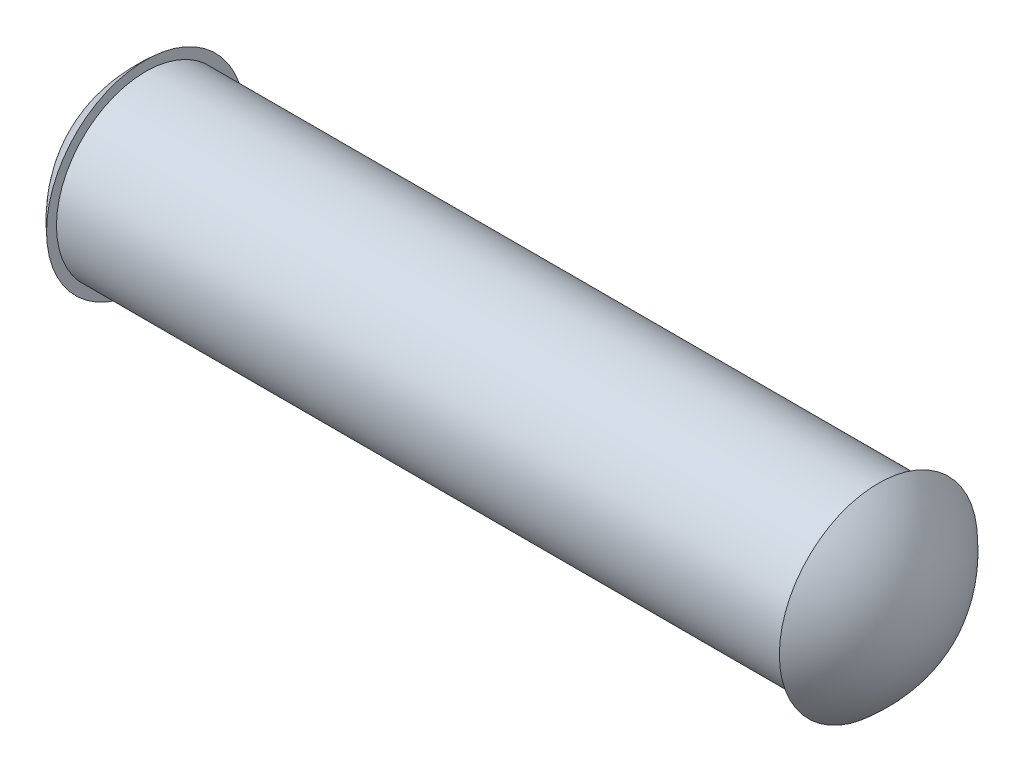
ISO-10303-21;
HEADER;
FILE_DESCRIPTION(('STEP AP214'),'2;1');
FILE_NAME('part.step','',(''),(''),'','','');
FILE_SCHEMA(('AUTOMOTIVE_DESIGN { 1 0 10303 214 1 1 1 1 }'));
ENDSEC;
DATA;
#1=APPLICATION_CONTEXT('core data for automotive mechanical design processes');
#2=APPLICATION_PROTOCOL_DEFINITION('international standard','automotive_design',2000,#1);
#3=PRODUCT_CONTEXT('',#1,'mechanical');
#4=PRODUCT('Part','Part','',(#3));
#5=PRODUCT_RELATED_PRODUCT_CATEGORY('part','',(#4));
#6=PRODUCT_DEFINITION_FORMATION('','',#4);
#7=PRODUCT_DEFINITION_CONTEXT('part definition',#1,'design');
#8=PRODUCT_DEFINITION('design','',#6,#7);
#9=PRODUCT_DEFINITION_SHAPE('','',#8);
#10=(LENGTH_UNIT() NAMED_UNIT(*) SI_UNIT(.MILLI.,.METRE.));
#11=(NAMED_UNIT(*) PLANE_ANGLE_UNIT() SI_UNIT($,.RADIAN.));
#12=(NAMED_UNIT(*) SI_UNIT($,.STERADIAN.) SOLID_ANGLE_UNIT());
#13=UNCERTAINTY_MEASURE_WITH_UNIT(LENGTH_MEASURE(1.E-05),#10,'distance_accuracy_value','');
#14=(GEOMETRIC_REPRESENTATION_CONTEXT(3) GLOBAL_UNCERTAINTY_ASSIGNED_CONTEXT((#13)) GLOBAL_UNIT_ASSIGNED_CONTEXT((#10,
#11,#12)) REPRESENTATION_CONTEXT('',''));
#15=CARTESIAN_POINT('',(0.,0.,0.));
#16=DIRECTION('',(0.,0.,1.));
#17=DIRECTION('',(1.,0.,0.));
#18=AXIS2_PLACEMENT_3D('',#15,#16,#17);
#19=CARTESIAN_POINT('',(-9.398,0.,0.));
#20=DIRECTION('',(1.,0.,0.));
#21=DIRECTION('',(0.,0.,-1.));
#22=AXIS2_PLACEMENT_3D('',#19,#20,#21);
#23=CYLINDRICAL_SURFACE('',#22,2.286);
#24=CARTESIAN_POINT('',(-9.398,0.,0.));
#25=DIRECTION('',(-1.,0.,0.));
#26=DIRECTION('',(0.,0.,1.));
#27=AXIS2_PLACEMENT_3D('',#24,#25,#26);
#28=CIRCLE('',#27,2.286);
#29=CARTESIAN_POINT('',(-9.398,0.,2.286));
#30=VERTEX_POINT('',#29);
#31=EDGE_CURVE('E71',#30,#30,#28,.F.);
#32=ORIENTED_EDGE('',*,*,#31,.T.);
#33=EDGE_LOOP('',(#32));
#34=FACE_BOUND('',#33,.T.);
#35=CARTESIAN_POINT('',(9.398,0.,0.));
#36=DIRECTION('',(1.,0.,0.));
#37=DIRECTION('',(0.,0.,-1.));
#38=AXIS2_PLACEMENT_3D('',#35,#36,#37);
#39=CIRCLE('',#38,2.286);
#40=CARTESIAN_POINT('',(9.398,0.,-2.286));
#41=VERTEX_POINT('',#40);
#42=EDGE_CURVE('E11',#41,#41,#39,.T.);
#43=ORIENTED_EDGE('',*,*,#42,.F.);
#44=EDGE_LOOP('',(#43));
#45=FACE_BOUND('',#44,.T.);
#46=ADVANCED_FACE('F32',(#34,#45),#23,.T.);
#47=CARTESIAN_POINT('',(10.668,0.,0.));
#48=CARTESIAN_POINT('',(10.668,0.,-1.41990316571237));
#49=CARTESIAN_POINT('',(9.398,0.,-2.54));
#50=B_SPLINE_CURVE_WITH_KNOTS('',2,(#47,#48,#49),.UNSPECIFIED.,.F.,.F.,(3,3),(0.,1.),.UNSPECIFIED.);
#51=CARTESIAN_POINT('',(9.398,0.,0.));
#52=DIRECTION('',(-1.,0.,0.));
#53=AXIS1_PLACEMENT('',#51,#52);
#54=SURFACE_OF_REVOLUTION('',#50,#53);
#55=CARTESIAN_POINT('',(9.398,0.,0.));
#56=DIRECTION('',(-1.,0.,0.));
#57=DIRECTION('',(0.,0.,1.));
#58=AXIS2_PLACEMENT_3D('',#55,#56,#57);
#59=CIRCLE('',#58,2.54);
#60=CARTESIAN_POINT('',(9.398,0.,2.54));
#61=VERTEX_POINT('',#60);
#62=EDGE_CURVE('E39',#61,#61,#59,.T.);
#63=ORIENTED_EDGE('',*,*,#62,.F.);
#64=EDGE_LOOP('',(#63));
#65=FACE_BOUND('',#64,.T.);
#66=CARTESIAN_POINT('',(10.668,0.,0.));
#67=VERTEX_POINT('',#66);
#68=VERTEX_LOOP('',#67);
#69=FACE_BOUND('',#68,.T.);
#70=ADVANCED_FACE('F57',(#65,#69),#54,.T.);
#71=CARTESIAN_POINT('',(9.398,0.,0.));
#72=DIRECTION('',(1.,0.,0.));
#73=DIRECTION('',(0.,0.,-1.));
#74=AXIS2_PLACEMENT_3D('',#71,#72,#73);
#75=PLANE('',#74);
#76=ORIENTED_EDGE('',*,*,#42,.T.);
#77=EDGE_LOOP('',(#76));
#78=FACE_BOUND('',#77,.T.);
#79=ORIENTED_EDGE('',*,*,#62,.T.);
#80=EDGE_LOOP('',(#79));
#81=FACE_BOUND('',#80,.T.);
#82=ADVANCED_FACE('F48',(#78,#81),#75,.F.);
#83=CARTESIAN_POINT('',(-10.668,0.,0.));
#84=CARTESIAN_POINT('',(-10.668,0.,-1.41990316571237));
#85=CARTESIAN_POINT('',(-9.398,0.,-2.54));
#86=B_SPLINE_CURVE_WITH_KNOTS('',2,(#83,#84,#85),.UNSPECIFIED.,.F.,.F.,(3,3),(0.,1.),.UNSPECIFIED.);
#87=CARTESIAN_POINT('',(-9.398,0.,0.));
#88=DIRECTION('',(1.,0.,0.));
#89=AXIS1_PLACEMENT('',#87,#88);
#90=SURFACE_OF_REVOLUTION('',#86,#89);
#91=CARTESIAN_POINT('',(-9.398,0.,0.));
#92=DIRECTION('',(-1.,0.,0.));
#93=DIRECTION('',(0.,0.,1.));
#94=AXIS2_PLACEMENT_3D('',#91,#92,#93);
#95=CIRCLE('',#94,2.54);
#96=CARTESIAN_POINT('',(-9.398,0.,2.54));
#97=VERTEX_POINT('',#96);
#98=EDGE_CURVE('E76',#97,#97,#95,.T.);
#99=ORIENTED_EDGE('',*,*,#98,.T.);
#100=EDGE_LOOP('',(#99));
#101=FACE_BOUND('',#100,.T.);
#102=CARTESIAN_POINT('',(-10.668,0.,0.));
#103=VERTEX_POINT('',#102);
#104=VERTEX_LOOP('',#103);
#105=FACE_BOUND('',#104,.T.);
#106=ADVANCED_FACE('F45',(#101,#105),#90,.T.);
#107=CARTESIAN_POINT('',(-9.398,0.,0.));
#108=DIRECTION('',(-1.,0.,0.));
#109=DIRECTION('',(0.,0.,-1.));
#110=AXIS2_PLACEMENT_3D('',#107,#108,#109);
#111=PLANE('',#110);
#112=ORIENTED_EDGE('',*,*,#31,.F.);
#113=EDGE_LOOP('',(#112));
#114=FACE_BOUND('',#113,.T.);
#115=ORIENTED_EDGE('',*,*,#98,.F.);
#116=EDGE_LOOP('',(#115));
#117=FACE_BOUND('',#116,.T.);
#118=ADVANCED_FACE('F47',(#114,#117),#111,.F.);
#119=CLOSED_SHELL('',(#46,#70,#82,#106,#118));
#120=MANIFOLD_SOLID_BREP('B2',#119);
#121=ADVANCED_BREP_SHAPE_REPRESENTATION('',(#18,#120),#14);
#122=SHAPE_DEFINITION_REPRESENTATION(#9,#121);
ENDSEC;
END-ISO-10303-21;
